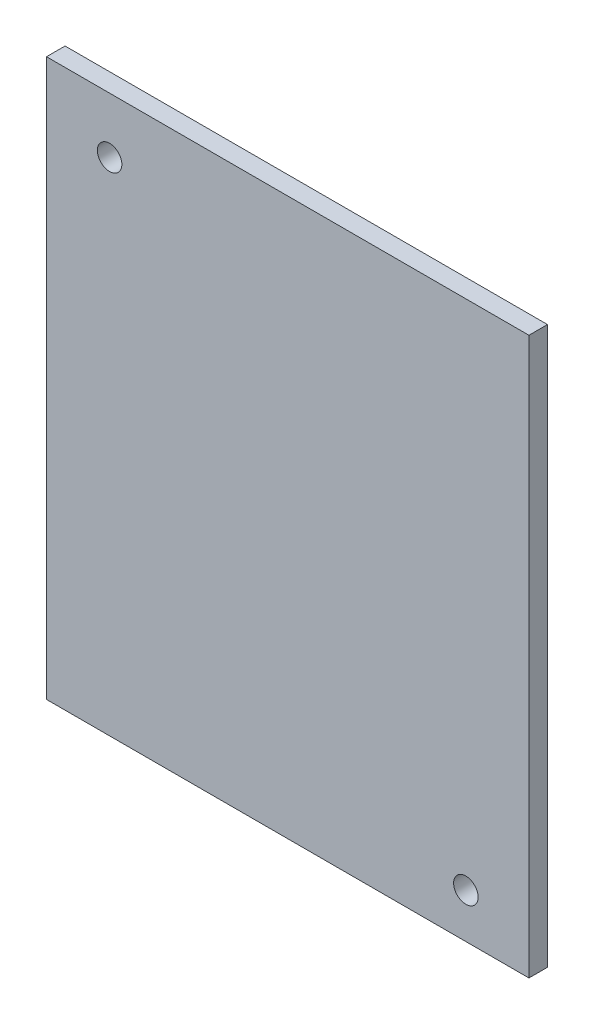
ISO-10303-21;
HEADER;
FILE_DESCRIPTION(('STEP AP214'),'2;1');
FILE_NAME('part.step','',(''),(''),'','','');
FILE_SCHEMA(('AUTOMOTIVE_DESIGN { 1 0 10303 214 1 1 1 1 }'));
ENDSEC;
DATA;
#1=APPLICATION_CONTEXT('core data for automotive mechanical design processes');
#2=APPLICATION_PROTOCOL_DEFINITION('international standard','automotive_design',2000,#1);
#3=PRODUCT_CONTEXT('',#1,'mechanical');
#4=PRODUCT('Part','Part','',(#3));
#5=PRODUCT_RELATED_PRODUCT_CATEGORY('part','',(#4));
#6=PRODUCT_DEFINITION_FORMATION('','',#4);
#7=PRODUCT_DEFINITION_CONTEXT('part definition',#1,'design');
#8=PRODUCT_DEFINITION('design','',#6,#7);
#9=PRODUCT_DEFINITION_SHAPE('','',#8);
#10=(LENGTH_UNIT() NAMED_UNIT(*) SI_UNIT(.MILLI.,.METRE.));
#11=(NAMED_UNIT(*) PLANE_ANGLE_UNIT() SI_UNIT($,.RADIAN.));
#12=(NAMED_UNIT(*) SI_UNIT($,.STERADIAN.) SOLID_ANGLE_UNIT());
#13=UNCERTAINTY_MEASURE_WITH_UNIT(LENGTH_MEASURE(1.E-05),#10,'distance_accuracy_value','');
#14=(GEOMETRIC_REPRESENTATION_CONTEXT(3) GLOBAL_UNCERTAINTY_ASSIGNED_CONTEXT((#13)) GLOBAL_UNIT_ASSIGNED_CONTEXT((#10,
#11,#12)) REPRESENTATION_CONTEXT('',''));
#15=CARTESIAN_POINT('',(0.,0.,0.));
#16=DIRECTION('',(0.,0.,1.));
#17=DIRECTION('',(1.,0.,0.));
#18=AXIS2_PLACEMENT_3D('',#15,#16,#17);
#19=CARTESIAN_POINT('',(0.,0.,2.5));
#20=DIRECTION('',(0.,0.,1.));
#21=DIRECTION('',(1.,0.,0.));
#22=AXIS2_PLACEMENT_3D('',#19,#20,#21);
#23=PLANE('',#22);
#24=CARTESIAN_POINT('',(-24.,147.97865418197,2.5));
#25=DIRECTION('',(0.,0.,1.));
#26=DIRECTION('',(1.,0.,0.));
#27=AXIS2_PLACEMENT_3D('',#24,#25,#26);
#28=CIRCLE('',#27,1.65000000000001);
#29=CARTESIAN_POINT('',(-22.35,147.97865418197,2.5));
#30=VERTEX_POINT('',#29);
#31=EDGE_CURVE('E101',#30,#30,#28,.T.);
#32=ORIENTED_EDGE('',*,*,#31,.F.);
#33=EDGE_LOOP('',(#32));
#34=FACE_BOUND('',#33,.T.);
#35=DIRECTION('',(0.,1.,0.));
#36=VECTOR('',#35,1.);
#37=CARTESIAN_POINT('',(32.5,155.47865418197,2.5));
#38=LINE('',#37,#36);
#39=CARTESIAN_POINT('',(32.5,80.4786541819704,2.5));
#40=VERTEX_POINT('',#39);
#41=CARTESIAN_POINT('',(32.5,155.47865418197,2.5));
#42=VERTEX_POINT('',#41);
#43=EDGE_CURVE('E86',#40,#42,#38,.T.);
#44=ORIENTED_EDGE('',*,*,#43,.T.);
#45=DIRECTION('',(-1.,0.,0.));
#46=VECTOR('',#45,1.);
#47=CARTESIAN_POINT('',(-32.5,155.47865418197,2.5));
#48=LINE('',#47,#46);
#49=CARTESIAN_POINT('',(-32.5,155.47865418197,2.5));
#50=VERTEX_POINT('',#49);
#51=EDGE_CURVE('E81',#42,#50,#48,.T.);
#52=ORIENTED_EDGE('',*,*,#51,.T.);
#53=DIRECTION('',(0.,-1.,0.));
#54=VECTOR('',#53,1.);
#55=CARTESIAN_POINT('',(-32.5,155.47865418197,2.5));
#56=LINE('',#55,#54);
#57=CARTESIAN_POINT('',(-32.5,80.4786541819704,2.5));
#58=VERTEX_POINT('',#57);
#59=EDGE_CURVE('E84',#50,#58,#56,.T.);
#60=ORIENTED_EDGE('',*,*,#59,.T.);
#61=DIRECTION('',(1.,0.,0.));
#62=VECTOR('',#61,1.);
#63=CARTESIAN_POINT('',(-32.5,80.4786541819704,2.5));
#64=LINE('',#63,#62);
#65=EDGE_CURVE('E51',#58,#40,#64,.T.);
#66=ORIENTED_EDGE('',*,*,#65,.T.);
#67=EDGE_LOOP('',(#44,#52,#60,#66));
#68=FACE_BOUND('',#67,.T.);
#69=CARTESIAN_POINT('',(24.,86.4786541819704,2.5));
#70=DIRECTION('',(0.,0.,1.));
#71=DIRECTION('',(1.,0.,0.));
#72=AXIS2_PLACEMENT_3D('',#69,#70,#71);
#73=CIRCLE('',#72,1.65);
#74=CARTESIAN_POINT('',(25.65,86.4786541819704,2.5));
#75=VERTEX_POINT('',#74);
#76=EDGE_CURVE('E116',#75,#75,#73,.T.);
#77=ORIENTED_EDGE('',*,*,#76,.F.);
#78=EDGE_LOOP('',(#77));
#79=FACE_BOUND('',#78,.T.);
#80=ADVANCED_FACE('F34',(#34,#68,#79),#23,.T.);
#81=CARTESIAN_POINT('',(0.,0.,0.));
#82=DIRECTION('',(0.,0.,1.));
#83=DIRECTION('',(1.,0.,0.));
#84=AXIS2_PLACEMENT_3D('',#81,#82,#83);
#85=PLANE('',#84);
#86=DIRECTION('',(0.,1.,0.));
#87=VECTOR('',#86,1.);
#88=CARTESIAN_POINT('',(32.5,155.47865418197,0.));
#89=LINE('',#88,#87);
#90=CARTESIAN_POINT('',(32.5,80.4786541819704,0.));
#91=VERTEX_POINT('',#90);
#92=CARTESIAN_POINT('',(32.5,155.47865418197,0.));
#93=VERTEX_POINT('',#92);
#94=EDGE_CURVE('E98',#91,#93,#89,.T.);
#95=ORIENTED_EDGE('',*,*,#94,.F.);
#96=DIRECTION('',(1.,0.,0.));
#97=VECTOR('',#96,1.);
#98=CARTESIAN_POINT('',(-32.5,80.4786541819704,0.));
#99=LINE('',#98,#97);
#100=CARTESIAN_POINT('',(-32.5,80.4786541819704,0.));
#101=VERTEX_POINT('',#100);
#102=EDGE_CURVE('E74',#101,#91,#99,.T.);
#103=ORIENTED_EDGE('',*,*,#102,.F.);
#104=DIRECTION('',(0.,-1.,0.));
#105=VECTOR('',#104,1.);
#106=CARTESIAN_POINT('',(-32.5,155.47865418197,0.));
#107=LINE('',#106,#105);
#108=CARTESIAN_POINT('',(-32.5,155.47865418197,0.));
#109=VERTEX_POINT('',#108);
#110=EDGE_CURVE('E68',#109,#101,#107,.T.);
#111=ORIENTED_EDGE('',*,*,#110,.F.);
#112=DIRECTION('',(-1.,0.,0.));
#113=VECTOR('',#112,1.);
#114=CARTESIAN_POINT('',(-32.5,155.47865418197,0.));
#115=LINE('',#114,#113);
#116=EDGE_CURVE('E90',#93,#109,#115,.T.);
#117=ORIENTED_EDGE('',*,*,#116,.F.);
#118=EDGE_LOOP('',(#95,#103,#111,#117));
#119=FACE_BOUND('',#118,.T.);
#120=CARTESIAN_POINT('',(-24.,147.97865418197,0.));
#121=DIRECTION('',(0.,0.,1.));
#122=DIRECTION('',(1.,0.,0.));
#123=AXIS2_PLACEMENT_3D('',#120,#121,#122);
#124=CIRCLE('',#123,1.65000000000001);
#125=CARTESIAN_POINT('',(-22.35,147.97865418197,0.));
#126=VERTEX_POINT('',#125);
#127=EDGE_CURVE('E113',#126,#126,#124,.T.);
#128=ORIENTED_EDGE('',*,*,#127,.T.);
#129=EDGE_LOOP('',(#128));
#130=FACE_BOUND('',#129,.T.);
#131=CARTESIAN_POINT('',(24.,86.4786541819704,0.));
#132=DIRECTION('',(0.,0.,1.));
#133=DIRECTION('',(1.,0.,0.));
#134=AXIS2_PLACEMENT_3D('',#131,#132,#133);
#135=CIRCLE('',#134,1.65);
#136=CARTESIAN_POINT('',(25.65,86.4786541819704,0.));
#137=VERTEX_POINT('',#136);
#138=EDGE_CURVE('E119',#137,#137,#135,.T.);
#139=ORIENTED_EDGE('',*,*,#138,.T.);
#140=EDGE_LOOP('',(#139));
#141=FACE_BOUND('',#140,.T.);
#142=ADVANCED_FACE('F109',(#119,#130,#141),#85,.F.);
#143=CARTESIAN_POINT('',(32.5,155.47865418197,2.5));
#144=DIRECTION('',(-1.,0.,0.));
#145=DIRECTION('',(0.,-1.,0.));
#146=AXIS2_PLACEMENT_3D('',#143,#144,#145);
#147=PLANE('',#146);
#148=ORIENTED_EDGE('',*,*,#94,.T.);
#149=DIRECTION('',(0.,0.,-1.));
#150=VECTOR('',#149,1.);
#151=CARTESIAN_POINT('',(32.5,155.47865418197,2.5));
#152=LINE('',#151,#150);
#153=EDGE_CURVE('E11',#42,#93,#152,.T.);
#154=ORIENTED_EDGE('',*,*,#153,.F.);
#155=ORIENTED_EDGE('',*,*,#43,.F.);
#156=DIRECTION('',(0.,0.,-1.));
#157=VECTOR('',#156,1.);
#158=CARTESIAN_POINT('',(32.5,80.4786541819704,2.5));
#159=LINE('',#158,#157);
#160=EDGE_CURVE('E94',#40,#91,#159,.T.);
#161=ORIENTED_EDGE('',*,*,#160,.T.);
#162=EDGE_LOOP('',(#148,#154,#155,#161));
#163=FACE_BOUND('',#162,.T.);
#164=ADVANCED_FACE('F36',(#163),#147,.F.);
#165=CARTESIAN_POINT('',(-32.5,155.47865418197,2.5));
#166=DIRECTION('',(0.,-1.,0.));
#167=DIRECTION('',(0.,0.,-1.));
#168=AXIS2_PLACEMENT_3D('',#165,#166,#167);
#169=PLANE('',#168);
#170=ORIENTED_EDGE('',*,*,#116,.T.);
#171=DIRECTION('',(0.,0.,-1.));
#172=VECTOR('',#171,1.);
#173=CARTESIAN_POINT('',(-32.5,155.47865418197,2.5));
#174=LINE('',#173,#172);
#175=EDGE_CURVE('E43',#50,#109,#174,.T.);
#176=ORIENTED_EDGE('',*,*,#175,.F.);
#177=ORIENTED_EDGE('',*,*,#51,.F.);
#178=ORIENTED_EDGE('',*,*,#153,.T.);
#179=EDGE_LOOP('',(#170,#176,#177,#178));
#180=FACE_BOUND('',#179,.T.);
#181=ADVANCED_FACE('F89',(#180),#169,.F.);
#182=CARTESIAN_POINT('',(-32.5,155.47865418197,2.5));
#183=DIRECTION('',(1.,0.,0.));
#184=DIRECTION('',(0.,1.,0.));
#185=AXIS2_PLACEMENT_3D('',#182,#183,#184);
#186=PLANE('',#185);
#187=ORIENTED_EDGE('',*,*,#110,.T.);
#188=DIRECTION('',(0.,0.,-1.));
#189=VECTOR('',#188,1.);
#190=CARTESIAN_POINT('',(-32.5,80.4786541819704,2.5));
#191=LINE('',#190,#189);
#192=EDGE_CURVE('E91',#58,#101,#191,.T.);
#193=ORIENTED_EDGE('',*,*,#192,.F.);
#194=ORIENTED_EDGE('',*,*,#59,.F.);
#195=ORIENTED_EDGE('',*,*,#175,.T.);
#196=EDGE_LOOP('',(#187,#193,#194,#195));
#197=FACE_BOUND('',#196,.T.);
#198=ADVANCED_FACE('F92',(#197),#186,.F.);
#199=CARTESIAN_POINT('',(-32.5,80.4786541819704,2.5));
#200=DIRECTION('',(0.,1.,0.));
#201=DIRECTION('',(0.,0.,1.));
#202=AXIS2_PLACEMENT_3D('',#199,#200,#201);
#203=PLANE('',#202);
#204=ORIENTED_EDGE('',*,*,#102,.T.);
#205=ORIENTED_EDGE('',*,*,#160,.F.);
#206=ORIENTED_EDGE('',*,*,#65,.F.);
#207=ORIENTED_EDGE('',*,*,#192,.T.);
#208=EDGE_LOOP('',(#204,#205,#206,#207));
#209=FACE_BOUND('',#208,.T.);
#210=ADVANCED_FACE('F106',(#209),#203,.F.);
#211=CARTESIAN_POINT('',(-24.,147.97865418197,2.5));
#212=DIRECTION('',(0.,0.,-1.));
#213=DIRECTION('',(-1.,0.,0.));
#214=AXIS2_PLACEMENT_3D('',#211,#212,#213);
#215=CYLINDRICAL_SURFACE('',#214,1.65000000000001);
#216=ORIENTED_EDGE('',*,*,#31,.T.);
#217=EDGE_LOOP('',(#216));
#218=FACE_BOUND('',#217,.T.);
#219=ORIENTED_EDGE('',*,*,#127,.F.);
#220=EDGE_LOOP('',(#219));
#221=FACE_BOUND('',#220,.T.);
#222=ADVANCED_FACE('F136',(#218,#221),#215,.F.);
#223=CARTESIAN_POINT('',(24.,86.4786541819704,2.5));
#224=DIRECTION('',(0.,0.,-1.));
#225=DIRECTION('',(-1.,0.,0.));
#226=AXIS2_PLACEMENT_3D('',#223,#224,#225);
#227=CYLINDRICAL_SURFACE('',#226,1.65);
#228=ORIENTED_EDGE('',*,*,#76,.T.);
#229=EDGE_LOOP('',(#228));
#230=FACE_BOUND('',#229,.T.);
#231=ORIENTED_EDGE('',*,*,#138,.F.);
#232=EDGE_LOOP('',(#231));
#233=FACE_BOUND('',#232,.T.);
#234=ADVANCED_FACE('F125',(#230,#233),#227,.F.);
#235=CLOSED_SHELL('',(#80,#142,#164,#181,#198,#210,#222,#234));
#236=MANIFOLD_SOLID_BREP('B2',#235);
#237=ADVANCED_BREP_SHAPE_REPRESENTATION('',(#18,#236),#14);
#238=SHAPE_DEFINITION_REPRESENTATION(#9,#237);
ENDSEC;
END-ISO-10303-21;
